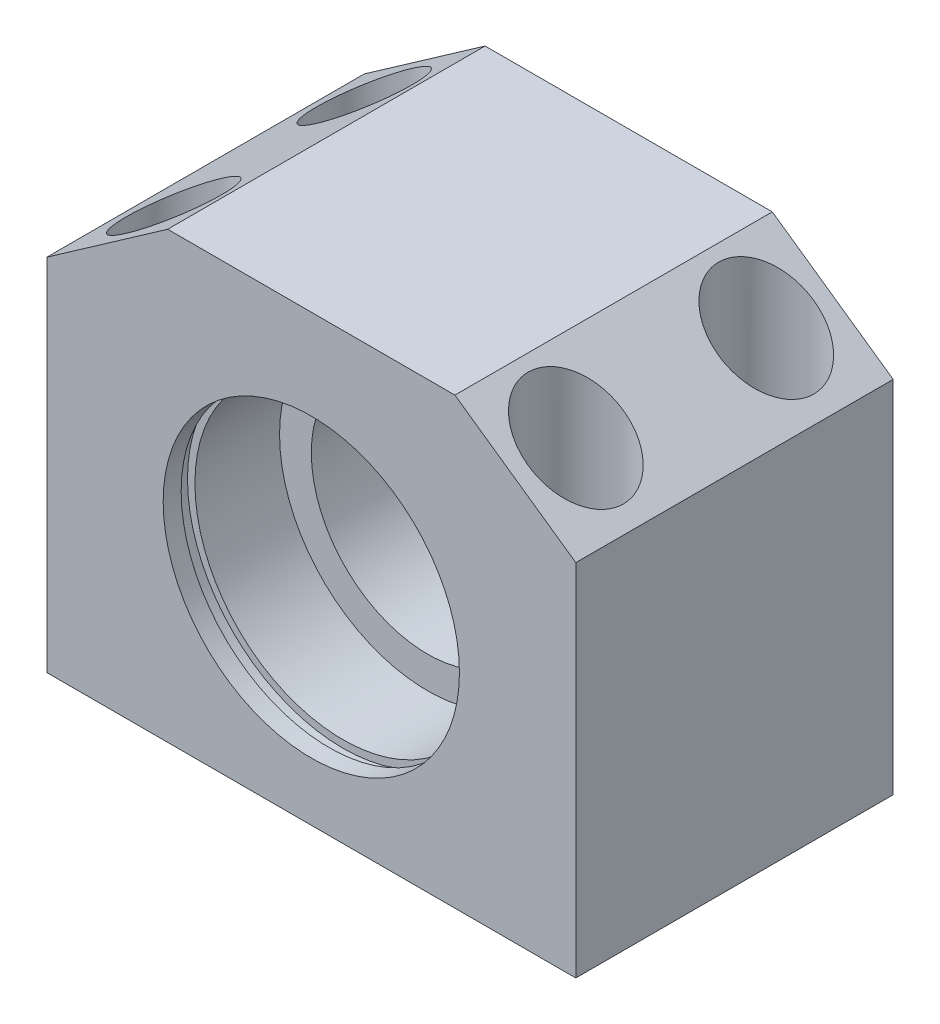
ISO-10303-21;
HEADER;
FILE_DESCRIPTION(('STEP AP214'),'2;1');
FILE_NAME('part.step','',(''),(''),'','','');
FILE_SCHEMA(('AUTOMOTIVE_DESIGN { 1 0 10303 214 1 1 1 1 }'));
ENDSEC;
DATA;
#1=APPLICATION_CONTEXT('core data for automotive mechanical design processes');
#2=APPLICATION_PROTOCOL_DEFINITION('international standard','automotive_design',2000,#1);
#3=PRODUCT_CONTEXT('',#1,'mechanical');
#4=PRODUCT('Part','Part','',(#3));
#5=PRODUCT_RELATED_PRODUCT_CATEGORY('part','',(#4));
#6=PRODUCT_DEFINITION_FORMATION('','',#4);
#7=PRODUCT_DEFINITION_CONTEXT('part definition',#1,'design');
#8=PRODUCT_DEFINITION('design','',#6,#7);
#9=PRODUCT_DEFINITION_SHAPE('','',#8);
#10=(LENGTH_UNIT() NAMED_UNIT(*) SI_UNIT(.MILLI.,.METRE.));
#11=(NAMED_UNIT(*) PLANE_ANGLE_UNIT() SI_UNIT($,.RADIAN.));
#12=(NAMED_UNIT(*) SI_UNIT($,.STERADIAN.) SOLID_ANGLE_UNIT());
#13=UNCERTAINTY_MEASURE_WITH_UNIT(LENGTH_MEASURE(1.E-05),#10,'distance_accuracy_value','');
#14=(GEOMETRIC_REPRESENTATION_CONTEXT(3) GLOBAL_UNCERTAINTY_ASSIGNED_CONTEXT((#13)) GLOBAL_UNIT_ASSIGNED_CONTEXT((#10,
#11,#12)) REPRESENTATION_CONTEXT('',''));
#15=CARTESIAN_POINT('',(0.,0.,0.));
#16=DIRECTION('',(0.,0.,1.));
#17=DIRECTION('',(1.,0.,0.));
#18=AXIS2_PLACEMENT_3D('',#15,#16,#17);
#19=CARTESIAN_POINT('',(0.,19.5,4.));
#20=DIRECTION('',(0.,0.,1.));
#21=DIRECTION('',(1.,0.,0.));
#22=AXIS2_PLACEMENT_3D('',#19,#20,#21);
#23=CYLINDRICAL_SURFACE('',#22,14.);
#24=CARTESIAN_POINT('',(0.,19.5,4.));
#25=DIRECTION('',(0.,0.,1.));
#26=DIRECTION('',(1.,0.,0.));
#27=AXIS2_PLACEMENT_3D('',#24,#25,#26);
#28=CIRCLE('',#27,14.);
#29=CARTESIAN_POINT('',(14.,19.5,4.));
#30=VERTEX_POINT('',#29);
#31=EDGE_CURVE('E131',#30,#30,#28,.T.);
#32=ORIENTED_EDGE('',*,*,#31,.F.);
#33=EDGE_LOOP('',(#32));
#34=FACE_BOUND('',#33,.T.);
#35=CARTESIAN_POINT('',(0.,19.5,12.));
#36=DIRECTION('',(0.,0.,-1.));
#37=DIRECTION('',(-1.,0.,0.));
#38=AXIS2_PLACEMENT_3D('',#35,#36,#37);
#39=CIRCLE('',#38,14.);
#40=CARTESIAN_POINT('',(-14.,19.5,12.));
#41=VERTEX_POINT('',#40);
#42=EDGE_CURVE('E139',#41,#41,#39,.T.);
#43=ORIENTED_EDGE('',*,*,#42,.F.);
#44=EDGE_LOOP('',(#43));
#45=FACE_BOUND('',#44,.T.);
#46=ADVANCED_FACE('F32',(#34,#45),#23,.F.);
#47=CARTESIAN_POINT('',(0.,19.5,15.));
#48=DIRECTION('',(0.,0.,1.));
#49=DIRECTION('',(1.,0.,0.));
#50=AXIS2_PLACEMENT_3D('',#47,#48,#49);
#51=CIRCLE('',#50,14.);
#52=CARTESIAN_POINT('',(14.,19.5,15.));
#53=VERTEX_POINT('',#52);
#54=EDGE_CURVE('E198',#53,#53,#51,.T.);
#55=ORIENTED_EDGE('',*,*,#54,.T.);
#56=EDGE_LOOP('',(#55));
#57=FACE_BOUND('',#56,.T.);
#58=CARTESIAN_POINT('',(0.,19.5,13.3));
#59=DIRECTION('',(0.,0.,-1.));
#60=DIRECTION('',(-1.,0.,0.));
#61=AXIS2_PLACEMENT_3D('',#58,#59,#60);
#62=CIRCLE('',#61,14.);
#63=CARTESIAN_POINT('',(-14.,19.5,13.3));
#64=VERTEX_POINT('',#63);
#65=EDGE_CURVE('E153',#64,#64,#62,.T.);
#66=ORIENTED_EDGE('',*,*,#65,.T.);
#67=EDGE_LOOP('',(#66));
#68=FACE_BOUND('',#67,.T.);
#69=ADVANCED_FACE('F234',(#57,#68),#23,.F.);
#70=CARTESIAN_POINT('',(0.,19.5,-15.));
#71=DIRECTION('',(0.,0.,1.));
#72=DIRECTION('',(1.,0.,0.));
#73=AXIS2_PLACEMENT_3D('',#70,#71,#72);
#74=CYLINDRICAL_SURFACE('',#73,11.);
#75=CARTESIAN_POINT('',(0.,19.5,-15.));
#76=DIRECTION('',(0.,0.,1.));
#77=DIRECTION('',(1.,0.,0.));
#78=AXIS2_PLACEMENT_3D('',#75,#76,#77);
#79=CIRCLE('',#78,11.);
#80=CARTESIAN_POINT('',(11.,19.5,-15.));
#81=VERTEX_POINT('',#80);
#82=EDGE_CURVE('E111',#81,#81,#79,.T.);
#83=ORIENTED_EDGE('',*,*,#82,.F.);
#84=EDGE_LOOP('',(#83));
#85=FACE_BOUND('',#84,.T.);
#86=CARTESIAN_POINT('',(0.,19.5,4.));
#87=DIRECTION('',(0.,0.,1.));
#88=DIRECTION('',(1.,0.,0.));
#89=AXIS2_PLACEMENT_3D('',#86,#87,#88);
#90=CIRCLE('',#89,11.);
#91=CARTESIAN_POINT('',(11.,19.5,4.));
#92=VERTEX_POINT('',#91);
#93=EDGE_CURVE('E116',#92,#92,#90,.F.);
#94=ORIENTED_EDGE('',*,*,#93,.F.);
#95=EDGE_LOOP('',(#94));
#96=FACE_BOUND('',#95,.T.);
#97=ADVANCED_FACE('F240',(#85,#96),#74,.F.);
#98=CARTESIAN_POINT('',(25.,42.,15.));
#99=DIRECTION('',(-1.,0.,0.));
#100=DIRECTION('',(0.,0.,1.));
#101=AXIS2_PLACEMENT_3D('',#98,#99,#100);
#102=PLANE('',#101);
#103=DIRECTION('',(0.,-1.,0.));
#104=VECTOR('',#103,1.);
#105=CARTESIAN_POINT('',(25.,42.,-15.));
#106=LINE('',#105,#104);
#107=CARTESIAN_POINT('',(25.,34.,-15.));
#108=VERTEX_POINT('',#107);
#109=CARTESIAN_POINT('',(25.,0.,-15.));
#110=VERTEX_POINT('',#109);
#111=EDGE_CURVE('E11',#108,#110,#106,.T.);
#112=ORIENTED_EDGE('',*,*,#111,.F.);
#113=DIRECTION('',(0.,0.,1.));
#114=VECTOR('',#113,1.);
#115=CARTESIAN_POINT('',(25.,34.,-15.));
#116=LINE('',#115,#114);
#117=CARTESIAN_POINT('',(25.,34.,15.));
#118=VERTEX_POINT('',#117);
#119=EDGE_CURVE('E85',#108,#118,#116,.T.);
#120=ORIENTED_EDGE('',*,*,#119,.T.);
#121=DIRECTION('',(0.,-1.,0.));
#122=VECTOR('',#121,1.);
#123=CARTESIAN_POINT('',(25.,42.,15.));
#124=LINE('',#123,#122);
#125=CARTESIAN_POINT('',(25.,0.,15.));
#126=VERTEX_POINT('',#125);
#127=EDGE_CURVE('E106',#118,#126,#124,.T.);
#128=ORIENTED_EDGE('',*,*,#127,.T.);
#129=DIRECTION('',(0.,0.,-1.));
#130=VECTOR('',#129,1.);
#131=CARTESIAN_POINT('',(25.,0.,15.));
#132=LINE('',#131,#130);
#133=EDGE_CURVE('E105',#126,#110,#132,.T.);
#134=ORIENTED_EDGE('',*,*,#133,.T.);
#135=EDGE_LOOP('',(#112,#120,#128,#134));
#136=FACE_BOUND('',#135,.T.);
#137=ADVANCED_FACE('F34',(#136),#102,.F.);
#138=CARTESIAN_POINT('',(-25.,42.,-15.));
#139=DIRECTION('',(0.,0.,1.));
#140=DIRECTION('',(1.,0.,0.));
#141=AXIS2_PLACEMENT_3D('',#138,#139,#140);
#142=PLANE('',#141);
#143=ORIENTED_EDGE('',*,*,#82,.T.);
#144=EDGE_LOOP('',(#143));
#145=FACE_BOUND('',#144,.T.);
#146=DIRECTION('',(-1.,0.,0.));
#147=VECTOR('',#146,1.);
#148=CARTESIAN_POINT('',(-25.,42.,-15.));
#149=LINE('',#148,#147);
#150=CARTESIAN_POINT('',(13.5748159460631,42.,-15.));
#151=VERTEX_POINT('',#150);
#152=CARTESIAN_POINT('',(-13.5748159460631,42.,-15.));
#153=VERTEX_POINT('',#152);
#154=EDGE_CURVE('E101',#151,#153,#149,.T.);
#155=ORIENTED_EDGE('',*,*,#154,.F.);
#156=DIRECTION('',(0.819152044288991,-0.573576436351047,0.));
#157=VECTOR('',#156,1.);
#158=CARTESIAN_POINT('',(24.1995227617896,34.5605001963602,-15.));
#159=LINE('',#158,#157);
#160=EDGE_CURVE('E49',#151,#108,#159,.T.);
#161=ORIENTED_EDGE('',*,*,#160,.T.);
#162=ORIENTED_EDGE('',*,*,#111,.T.);
#163=DIRECTION('',(-1.,0.,0.));
#164=VECTOR('',#163,1.);
#165=CARTESIAN_POINT('',(-25.,0.,-15.));
#166=LINE('',#165,#164);
#167=CARTESIAN_POINT('',(-25.,0.,-15.));
#168=VERTEX_POINT('',#167);
#169=EDGE_CURVE('E110',#110,#168,#166,.T.);
#170=ORIENTED_EDGE('',*,*,#169,.T.);
#171=DIRECTION('',(0.,-1.,0.));
#172=VECTOR('',#171,1.);
#173=CARTESIAN_POINT('',(-25.,42.,-15.));
#174=LINE('',#173,#172);
#175=CARTESIAN_POINT('',(-25.,34.,-15.));
#176=VERTEX_POINT('',#175);
#177=EDGE_CURVE('E41',#176,#168,#174,.T.);
#178=ORIENTED_EDGE('',*,*,#177,.F.);
#179=DIRECTION('',(0.819152044288991,0.573576436351048,0.));
#180=VECTOR('',#179,1.);
#181=CARTESIAN_POINT('',(-24.1995227617897,34.5605001963602,-15.));
#182=LINE('',#181,#180);
#183=EDGE_CURVE('E146',#176,#153,#182,.T.);
#184=ORIENTED_EDGE('',*,*,#183,.T.);
#185=EDGE_LOOP('',(#155,#161,#162,#170,#178,#184));
#186=FACE_BOUND('',#185,.T.);
#187=ADVANCED_FACE('F97',(#145,#186),#142,.F.);
#188=CARTESIAN_POINT('',(-25.,42.,15.));
#189=DIRECTION('',(1.,0.,0.));
#190=DIRECTION('',(0.,0.,-1.));
#191=AXIS2_PLACEMENT_3D('',#188,#189,#190);
#192=PLANE('',#191);
#193=DIRECTION('',(0.,-1.,0.));
#194=VECTOR('',#193,1.);
#195=CARTESIAN_POINT('',(-25.,42.,15.));
#196=LINE('',#195,#194);
#197=CARTESIAN_POINT('',(-25.,34.,15.));
#198=VERTEX_POINT('',#197);
#199=CARTESIAN_POINT('',(-25.,0.,15.));
#200=VERTEX_POINT('',#199);
#201=EDGE_CURVE('E127',#198,#200,#196,.T.);
#202=ORIENTED_EDGE('',*,*,#201,.F.);
#203=DIRECTION('',(0.,0.,1.));
#204=VECTOR('',#203,1.);
#205=CARTESIAN_POINT('',(-25.,34.,-15.));
#206=LINE('',#205,#204);
#207=EDGE_CURVE('E141',#176,#198,#206,.T.);
#208=ORIENTED_EDGE('',*,*,#207,.F.);
#209=ORIENTED_EDGE('',*,*,#177,.T.);
#210=DIRECTION('',(0.,0.,1.));
#211=VECTOR('',#210,1.);
#212=CARTESIAN_POINT('',(-25.,0.,15.));
#213=LINE('',#212,#211);
#214=EDGE_CURVE('E113',#168,#200,#213,.T.);
#215=ORIENTED_EDGE('',*,*,#214,.T.);
#216=EDGE_LOOP('',(#202,#208,#209,#215));
#217=FACE_BOUND('',#216,.T.);
#218=ADVANCED_FACE('F216',(#217),#192,.F.);
#219=CARTESIAN_POINT('',(-25.,42.,15.));
#220=DIRECTION('',(0.,0.,-1.));
#221=DIRECTION('',(-1.,0.,0.));
#222=AXIS2_PLACEMENT_3D('',#219,#220,#221);
#223=PLANE('',#222);
#224=ORIENTED_EDGE('',*,*,#54,.F.);
#225=EDGE_LOOP('',(#224));
#226=FACE_BOUND('',#225,.T.);
#227=ORIENTED_EDGE('',*,*,#127,.F.);
#228=DIRECTION('',(0.819152044288991,-0.573576436351047,0.));
#229=VECTOR('',#228,1.);
#230=CARTESIAN_POINT('',(24.1995227617896,34.5605001963602,15.));
#231=LINE('',#230,#229);
#232=CARTESIAN_POINT('',(13.5748159460631,42.,15.));
#233=VERTEX_POINT('',#232);
#234=EDGE_CURVE('E89',#233,#118,#231,.T.);
#235=ORIENTED_EDGE('',*,*,#234,.F.);
#236=DIRECTION('',(1.,0.,0.));
#237=VECTOR('',#236,1.);
#238=CARTESIAN_POINT('',(-25.,42.,15.));
#239=LINE('',#238,#237);
#240=CARTESIAN_POINT('',(-13.5748159460631,42.,15.));
#241=VERTEX_POINT('',#240);
#242=EDGE_CURVE('E119',#241,#233,#239,.T.);
#243=ORIENTED_EDGE('',*,*,#242,.F.);
#244=DIRECTION('',(0.819152044288991,0.573576436351048,0.));
#245=VECTOR('',#244,1.);
#246=CARTESIAN_POINT('',(-24.1995227617897,34.5605001963602,15.));
#247=LINE('',#246,#245);
#248=EDGE_CURVE('E57',#198,#241,#247,.T.);
#249=ORIENTED_EDGE('',*,*,#248,.F.);
#250=ORIENTED_EDGE('',*,*,#201,.T.);
#251=DIRECTION('',(1.,0.,0.));
#252=VECTOR('',#251,1.);
#253=CARTESIAN_POINT('',(-25.,0.,15.));
#254=LINE('',#253,#252);
#255=EDGE_CURVE('E124',#200,#126,#254,.T.);
#256=ORIENTED_EDGE('',*,*,#255,.T.);
#257=EDGE_LOOP('',(#227,#235,#243,#249,#250,#256));
#258=FACE_BOUND('',#257,.T.);
#259=ADVANCED_FACE('F204',(#226,#258),#223,.F.);
#260=CARTESIAN_POINT('',(0.,42.,0.));
#261=DIRECTION('',(0.,-1.,0.));
#262=DIRECTION('',(0.,0.,-1.));
#263=AXIS2_PLACEMENT_3D('',#260,#261,#262);
#264=PLANE('',#263);
#265=ORIENTED_EDGE('',*,*,#242,.T.);
#266=DIRECTION('',(0.,0.,1.));
#267=VECTOR('',#266,1.);
#268=CARTESIAN_POINT('',(13.5748159460631,42.,-15.));
#269=LINE('',#268,#267);
#270=EDGE_CURVE('E93',#151,#233,#269,.T.);
#271=ORIENTED_EDGE('',*,*,#270,.F.);
#272=ORIENTED_EDGE('',*,*,#154,.T.);
#273=DIRECTION('',(0.,0.,1.));
#274=VECTOR('',#273,1.);
#275=CARTESIAN_POINT('',(-13.5748159460631,42.,-15.));
#276=LINE('',#275,#274);
#277=EDGE_CURVE('E135',#153,#241,#276,.T.);
#278=ORIENTED_EDGE('',*,*,#277,.T.);
#279=EDGE_LOOP('',(#265,#271,#272,#278));
#280=FACE_BOUND('',#279,.T.);
#281=ADVANCED_FACE('F202',(#280),#264,.F.);
#282=CARTESIAN_POINT('',(0.,0.,0.));
#283=DIRECTION('',(0.,-1.,0.));
#284=DIRECTION('',(0.,0.,-1.));
#285=AXIS2_PLACEMENT_3D('',#282,#283,#284);
#286=PLANE('',#285);
#287=CARTESIAN_POINT('',(19.,0.,-9.));
#288=DIRECTION('',(0.,1.,0.));
#289=DIRECTION('',(0.,0.,1.));
#290=AXIS2_PLACEMENT_3D('',#287,#288,#289);
#291=CIRCLE('',#290,2.74999999999999);
#292=CARTESIAN_POINT('',(19.,0.,-6.25000000000001));
#293=VERTEX_POINT('',#292);
#294=EDGE_CURVE('E168',#293,#293,#291,.T.);
#295=ORIENTED_EDGE('',*,*,#294,.T.);
#296=EDGE_LOOP('',(#295));
#297=FACE_BOUND('',#296,.T.);
#298=CARTESIAN_POINT('',(19.,0.,9.));
#299=DIRECTION('',(0.,1.,0.));
#300=DIRECTION('',(0.,0.,1.));
#301=AXIS2_PLACEMENT_3D('',#298,#299,#300);
#302=CIRCLE('',#301,2.74999999999999);
#303=CARTESIAN_POINT('',(19.,0.,11.75));
#304=VERTEX_POINT('',#303);
#305=EDGE_CURVE('E177',#304,#304,#302,.T.);
#306=ORIENTED_EDGE('',*,*,#305,.T.);
#307=EDGE_LOOP('',(#306));
#308=FACE_BOUND('',#307,.T.);
#309=CARTESIAN_POINT('',(-19.,0.,9.));
#310=DIRECTION('',(0.,1.,0.));
#311=DIRECTION('',(0.,0.,1.));
#312=AXIS2_PLACEMENT_3D('',#309,#310,#311);
#313=CIRCLE('',#312,2.74999999999999);
#314=CARTESIAN_POINT('',(-19.,0.,11.75));
#315=VERTEX_POINT('',#314);
#316=EDGE_CURVE('E186',#315,#315,#313,.T.);
#317=ORIENTED_EDGE('',*,*,#316,.T.);
#318=EDGE_LOOP('',(#317));
#319=FACE_BOUND('',#318,.T.);
#320=CARTESIAN_POINT('',(-19.,0.,-9.));
#321=DIRECTION('',(0.,1.,0.));
#322=DIRECTION('',(0.,0.,1.));
#323=AXIS2_PLACEMENT_3D('',#320,#321,#322);
#324=CIRCLE('',#323,2.74999999999999);
#325=CARTESIAN_POINT('',(-19.,0.,-6.25000000000001));
#326=VERTEX_POINT('',#325);
#327=EDGE_CURVE('E195',#326,#326,#324,.T.);
#328=ORIENTED_EDGE('',*,*,#327,.T.);
#329=EDGE_LOOP('',(#328));
#330=FACE_BOUND('',#329,.T.);
#331=ORIENTED_EDGE('',*,*,#133,.F.);
#332=ORIENTED_EDGE('',*,*,#255,.F.);
#333=ORIENTED_EDGE('',*,*,#214,.F.);
#334=ORIENTED_EDGE('',*,*,#169,.F.);
#335=EDGE_LOOP('',(#331,#332,#333,#334));
#336=FACE_BOUND('',#335,.T.);
#337=ADVANCED_FACE('F218',(#297,#308,#319,#330,#336),#286,.T.);
#338=CARTESIAN_POINT('',(0.,19.5,4.));
#339=DIRECTION('',(0.,0.,1.));
#340=DIRECTION('',(1.,0.,0.));
#341=AXIS2_PLACEMENT_3D('',#338,#339,#340);
#342=PLANE('',#341);
#343=ORIENTED_EDGE('',*,*,#31,.T.);
#344=EDGE_LOOP('',(#343));
#345=FACE_BOUND('',#344,.T.);
#346=ORIENTED_EDGE('',*,*,#93,.T.);
#347=EDGE_LOOP('',(#346));
#348=FACE_BOUND('',#347,.T.);
#349=ADVANCED_FACE('F220',(#345,#348),#342,.T.);
#350=CARTESIAN_POINT('',(-19.,42.,-9.));
#351=DIRECTION('',(0.,1.,0.));
#352=DIRECTION('',(0.,0.,1.));
#353=AXIS2_PLACEMENT_3D('',#350,#351,#352);
#354=CYLINDRICAL_SURFACE('',#353,2.75);
#355=ORIENTED_EDGE('',*,*,#327,.F.);
#356=EDGE_LOOP('',(#355));
#357=FACE_BOUND('',#356,.T.);
#358=CARTESIAN_POINT('',(-19.,29.,-9.));
#359=DIRECTION('',(0.,1.,0.));
#360=DIRECTION('',(0.,0.,1.));
#361=AXIS2_PLACEMENT_3D('',#358,#359,#360);
#362=CIRCLE('',#361,2.75);
#363=CARTESIAN_POINT('',(-19.,29.,-6.25));
#364=VERTEX_POINT('',#363);
#365=EDGE_CURVE('E192',#364,#364,#362,.T.);
#366=ORIENTED_EDGE('',*,*,#365,.T.);
#367=EDGE_LOOP('',(#366));
#368=FACE_BOUND('',#367,.T.);
#369=ADVANCED_FACE('F227',(#357,#368),#354,.F.);
#370=CARTESIAN_POINT('',(-16.25,29.,-9.));
#371=DIRECTION('',(0.,-1.,0.));
#372=DIRECTION('',(0.,0.,-1.));
#373=AXIS2_PLACEMENT_3D('',#370,#371,#372);
#374=PLANE('',#373);
#375=ORIENTED_EDGE('',*,*,#365,.F.);
#376=EDGE_LOOP('',(#375));
#377=FACE_BOUND('',#376,.T.);
#378=CARTESIAN_POINT('',(-19.,29.,-9.));
#379=DIRECTION('',(0.,1.,0.));
#380=DIRECTION('',(0.,0.,1.));
#381=AXIS2_PLACEMENT_3D('',#378,#379,#380);
#382=CIRCLE('',#381,4.5);
#383=CARTESIAN_POINT('',(-19.,29.,-4.5));
#384=VERTEX_POINT('',#383);
#385=EDGE_CURVE('E189',#384,#384,#382,.T.);
#386=ORIENTED_EDGE('',*,*,#385,.T.);
#387=EDGE_LOOP('',(#386));
#388=FACE_BOUND('',#387,.T.);
#389=ADVANCED_FACE('F326',(#377,#388),#374,.F.);
#390=CARTESIAN_POINT('',(-19.,42.,-9.));
#391=DIRECTION('',(0.,1.,0.));
#392=DIRECTION('',(0.,0.,1.));
#393=AXIS2_PLACEMENT_3D('',#390,#391,#392);
#394=CYLINDRICAL_SURFACE('',#393,4.5);
#395=CARTESIAN_POINT('',(-19.,38.2012452292583,-9.));
#396=DIRECTION('',(0.573576436351048,-0.819152044288991,0.));
#397=DIRECTION('',(0.819152044288991,0.573576436351048,0.));
#398=AXIS2_PLACEMENT_3D('',#395,#396,#397);
#399=ELLIPSE('',#398,5.49348564942656,4.5);
#400=CARTESIAN_POINT('',(-14.5,41.352179151202,-9.));
#401=VERTEX_POINT('',#400);
#402=EDGE_CURVE('E134',#401,#401,#399,.F.);
#403=ORIENTED_EDGE('',*,*,#402,.T.);
#404=EDGE_LOOP('',(#403));
#405=FACE_BOUND('',#404,.T.);
#406=ORIENTED_EDGE('',*,*,#385,.F.);
#407=EDGE_LOOP('',(#406));
#408=FACE_BOUND('',#407,.T.);
#409=ADVANCED_FACE('F322',(#405,#408),#394,.F.);
#410=CARTESIAN_POINT('',(-19.,42.,9.));
#411=DIRECTION('',(0.,1.,0.));
#412=DIRECTION('',(0.,0.,1.));
#413=AXIS2_PLACEMENT_3D('',#410,#411,#412);
#414=CYLINDRICAL_SURFACE('',#413,2.75);
#415=ORIENTED_EDGE('',*,*,#316,.F.);
#416=EDGE_LOOP('',(#415));
#417=FACE_BOUND('',#416,.T.);
#418=CARTESIAN_POINT('',(-19.,29.,9.));
#419=DIRECTION('',(0.,1.,0.));
#420=DIRECTION('',(0.,0.,1.));
#421=AXIS2_PLACEMENT_3D('',#418,#419,#420);
#422=CIRCLE('',#421,2.75);
#423=CARTESIAN_POINT('',(-19.,29.,11.75));
#424=VERTEX_POINT('',#423);
#425=EDGE_CURVE('E183',#424,#424,#422,.T.);
#426=ORIENTED_EDGE('',*,*,#425,.T.);
#427=EDGE_LOOP('',(#426));
#428=FACE_BOUND('',#427,.T.);
#429=ADVANCED_FACE('F318',(#417,#428),#414,.F.);
#430=CARTESIAN_POINT('',(-16.25,29.,9.));
#431=DIRECTION('',(0.,-1.,0.));
#432=DIRECTION('',(0.,0.,-1.));
#433=AXIS2_PLACEMENT_3D('',#430,#431,#432);
#434=PLANE('',#433);
#435=ORIENTED_EDGE('',*,*,#425,.F.);
#436=EDGE_LOOP('',(#435));
#437=FACE_BOUND('',#436,.T.);
#438=CARTESIAN_POINT('',(-19.,29.,9.));
#439=DIRECTION('',(0.,1.,0.));
#440=DIRECTION('',(0.,0.,1.));
#441=AXIS2_PLACEMENT_3D('',#438,#439,#440);
#442=CIRCLE('',#441,4.5);
#443=CARTESIAN_POINT('',(-19.,29.,13.5));
#444=VERTEX_POINT('',#443);
#445=EDGE_CURVE('E180',#444,#444,#442,.T.);
#446=ORIENTED_EDGE('',*,*,#445,.T.);
#447=EDGE_LOOP('',(#446));
#448=FACE_BOUND('',#447,.T.);
#449=ADVANCED_FACE('F315',(#437,#448),#434,.F.);
#450=CARTESIAN_POINT('',(-19.,42.,9.));
#451=DIRECTION('',(0.,1.,0.));
#452=DIRECTION('',(0.,0.,1.));
#453=AXIS2_PLACEMENT_3D('',#450,#451,#452);
#454=CYLINDRICAL_SURFACE('',#453,4.5);
#455=CARTESIAN_POINT('',(-19.,38.2012452292583,9.));
#456=DIRECTION('',(0.573576436351048,-0.819152044288991,0.));
#457=DIRECTION('',(0.819152044288991,0.573576436351048,0.));
#458=AXIS2_PLACEMENT_3D('',#455,#456,#457);
#459=ELLIPSE('',#458,5.49348564942656,4.5);
#460=CARTESIAN_POINT('',(-14.5,41.352179151202,9.));
#461=VERTEX_POINT('',#460);
#462=EDGE_CURVE('E132',#461,#461,#459,.F.);
#463=ORIENTED_EDGE('',*,*,#462,.T.);
#464=EDGE_LOOP('',(#463));
#465=FACE_BOUND('',#464,.T.);
#466=ORIENTED_EDGE('',*,*,#445,.F.);
#467=EDGE_LOOP('',(#466));
#468=FACE_BOUND('',#467,.T.);
#469=ADVANCED_FACE('F311',(#465,#468),#454,.F.);
#470=CARTESIAN_POINT('',(19.,42.,9.));
#471=DIRECTION('',(0.,1.,0.));
#472=DIRECTION('',(0.,0.,1.));
#473=AXIS2_PLACEMENT_3D('',#470,#471,#472);
#474=CYLINDRICAL_SURFACE('',#473,2.75);
#475=ORIENTED_EDGE('',*,*,#305,.F.);
#476=EDGE_LOOP('',(#475));
#477=FACE_BOUND('',#476,.T.);
#478=CARTESIAN_POINT('',(19.,29.,9.));
#479=DIRECTION('',(0.,1.,0.));
#480=DIRECTION('',(0.,0.,1.));
#481=AXIS2_PLACEMENT_3D('',#478,#479,#480);
#482=CIRCLE('',#481,2.75);
#483=CARTESIAN_POINT('',(19.,29.,11.75));
#484=VERTEX_POINT('',#483);
#485=EDGE_CURVE('E174',#484,#484,#482,.T.);
#486=ORIENTED_EDGE('',*,*,#485,.T.);
#487=EDGE_LOOP('',(#486));
#488=FACE_BOUND('',#487,.T.);
#489=ADVANCED_FACE('F307',(#477,#488),#474,.F.);
#490=CARTESIAN_POINT('',(21.75,29.,9.));
#491=DIRECTION('',(0.,-1.,0.));
#492=DIRECTION('',(0.,0.,-1.));
#493=AXIS2_PLACEMENT_3D('',#490,#491,#492);
#494=PLANE('',#493);
#495=ORIENTED_EDGE('',*,*,#485,.F.);
#496=EDGE_LOOP('',(#495));
#497=FACE_BOUND('',#496,.T.);
#498=CARTESIAN_POINT('',(19.,29.,9.));
#499=DIRECTION('',(0.,1.,0.));
#500=DIRECTION('',(0.,0.,1.));
#501=AXIS2_PLACEMENT_3D('',#498,#499,#500);
#502=CIRCLE('',#501,4.5);
#503=CARTESIAN_POINT('',(19.,29.,13.5));
#504=VERTEX_POINT('',#503);
#505=EDGE_CURVE('E171',#504,#504,#502,.T.);
#506=ORIENTED_EDGE('',*,*,#505,.T.);
#507=EDGE_LOOP('',(#506));
#508=FACE_BOUND('',#507,.T.);
#509=ADVANCED_FACE('F303',(#497,#508),#494,.F.);
#510=CARTESIAN_POINT('',(19.,42.,9.));
#511=DIRECTION('',(0.,1.,0.));
#512=DIRECTION('',(0.,0.,1.));
#513=AXIS2_PLACEMENT_3D('',#510,#511,#512);
#514=CYLINDRICAL_SURFACE('',#513,4.5);
#515=CARTESIAN_POINT('',(19.,38.2012452292583,9.));
#516=DIRECTION('',(-0.573576436351047,-0.819152044288991,0.));
#517=DIRECTION('',(-0.819152044288991,0.573576436351047,0.));
#518=AXIS2_PLACEMENT_3D('',#515,#516,#517);
#519=ELLIPSE('',#518,5.49348564942655,4.5);
#520=CARTESIAN_POINT('',(14.5,41.352179151202,9.));
#521=VERTEX_POINT('',#520);
#522=EDGE_CURVE('E209',#521,#521,#519,.F.);
#523=ORIENTED_EDGE('',*,*,#522,.T.);
#524=EDGE_LOOP('',(#523));
#525=FACE_BOUND('',#524,.T.);
#526=ORIENTED_EDGE('',*,*,#505,.F.);
#527=EDGE_LOOP('',(#526));
#528=FACE_BOUND('',#527,.T.);
#529=ADVANCED_FACE('F299',(#525,#528),#514,.F.);
#530=CARTESIAN_POINT('',(19.,42.,-9.));
#531=DIRECTION('',(0.,1.,0.));
#532=DIRECTION('',(0.,0.,1.));
#533=AXIS2_PLACEMENT_3D('',#530,#531,#532);
#534=CYLINDRICAL_SURFACE('',#533,2.75);
#535=ORIENTED_EDGE('',*,*,#294,.F.);
#536=EDGE_LOOP('',(#535));
#537=FACE_BOUND('',#536,.T.);
#538=CARTESIAN_POINT('',(19.,29.,-9.));
#539=DIRECTION('',(0.,1.,0.));
#540=DIRECTION('',(0.,0.,1.));
#541=AXIS2_PLACEMENT_3D('',#538,#539,#540);
#542=CIRCLE('',#541,2.75);
#543=CARTESIAN_POINT('',(19.,29.,-6.25));
#544=VERTEX_POINT('',#543);
#545=EDGE_CURVE('E165',#544,#544,#542,.T.);
#546=ORIENTED_EDGE('',*,*,#545,.T.);
#547=EDGE_LOOP('',(#546));
#548=FACE_BOUND('',#547,.T.);
#549=ADVANCED_FACE('F295',(#537,#548),#534,.F.);
#550=CARTESIAN_POINT('',(21.75,29.,-9.));
#551=DIRECTION('',(0.,-1.,0.));
#552=DIRECTION('',(0.,0.,-1.));
#553=AXIS2_PLACEMENT_3D('',#550,#551,#552);
#554=PLANE('',#553);
#555=ORIENTED_EDGE('',*,*,#545,.F.);
#556=EDGE_LOOP('',(#555));
#557=FACE_BOUND('',#556,.T.);
#558=CARTESIAN_POINT('',(19.,29.,-9.));
#559=DIRECTION('',(0.,1.,0.));
#560=DIRECTION('',(0.,0.,1.));
#561=AXIS2_PLACEMENT_3D('',#558,#559,#560);
#562=CIRCLE('',#561,4.5);
#563=CARTESIAN_POINT('',(19.,29.,-4.5));
#564=VERTEX_POINT('',#563);
#565=EDGE_CURVE('E162',#564,#564,#562,.T.);
#566=ORIENTED_EDGE('',*,*,#565,.T.);
#567=EDGE_LOOP('',(#566));
#568=FACE_BOUND('',#567,.T.);
#569=ADVANCED_FACE('F291',(#557,#568),#554,.F.);
#570=CARTESIAN_POINT('',(19.,42.,-9.));
#571=DIRECTION('',(0.,1.,0.));
#572=DIRECTION('',(0.,0.,1.));
#573=AXIS2_PLACEMENT_3D('',#570,#571,#572);
#574=CYLINDRICAL_SURFACE('',#573,4.5);
#575=CARTESIAN_POINT('',(19.,38.2012452292583,-9.));
#576=DIRECTION('',(-0.573576436351047,-0.819152044288991,0.));
#577=DIRECTION('',(-0.819152044288991,0.573576436351047,0.));
#578=AXIS2_PLACEMENT_3D('',#575,#576,#577);
#579=ELLIPSE('',#578,5.49348564942655,4.5);
#580=CARTESIAN_POINT('',(14.5,41.352179151202,-9.));
#581=VERTEX_POINT('',#580);
#582=EDGE_CURVE('E36',#581,#581,#579,.F.);
#583=ORIENTED_EDGE('',*,*,#582,.T.);
#584=EDGE_LOOP('',(#583));
#585=FACE_BOUND('',#584,.T.);
#586=ORIENTED_EDGE('',*,*,#565,.F.);
#587=EDGE_LOOP('',(#586));
#588=FACE_BOUND('',#587,.T.);
#589=ADVANCED_FACE('F287',(#585,#588),#574,.F.);
#590=CARTESIAN_POINT('',(0.,5.5,12.));
#591=DIRECTION('',(0.,0.,1.));
#592=DIRECTION('',(1.,0.,0.));
#593=AXIS2_PLACEMENT_3D('',#590,#591,#592);
#594=PLANE('',#593);
#595=ORIENTED_EDGE('',*,*,#42,.T.);
#596=EDGE_LOOP('',(#595));
#597=FACE_BOUND('',#596,.T.);
#598=CARTESIAN_POINT('',(0.,19.5,12.));
#599=DIRECTION('',(0.,0.,-1.));
#600=DIRECTION('',(-1.,0.,0.));
#601=AXIS2_PLACEMENT_3D('',#598,#599,#600);
#602=CIRCLE('',#601,14.7);
#603=CARTESIAN_POINT('',(-14.7,19.5,12.));
#604=VERTEX_POINT('',#603);
#605=EDGE_CURVE('E159',#604,#604,#602,.T.);
#606=ORIENTED_EDGE('',*,*,#605,.F.);
#607=EDGE_LOOP('',(#606));
#608=FACE_BOUND('',#607,.T.);
#609=ADVANCED_FACE('F280',(#597,#608),#594,.T.);
#610=CARTESIAN_POINT('',(0.,19.5,9.29464911712331));
#611=DIRECTION('',(0.,0.,-1.));
#612=DIRECTION('',(-1.,0.,0.));
#613=AXIS2_PLACEMENT_3D('',#610,#611,#612);
#614=CYLINDRICAL_SURFACE('',#613,14.7);
#615=ORIENTED_EDGE('',*,*,#605,.T.);
#616=EDGE_LOOP('',(#615));
#617=FACE_BOUND('',#616,.T.);
#618=CARTESIAN_POINT('',(0.,19.5,13.3));
#619=DIRECTION('',(0.,0.,-1.));
#620=DIRECTION('',(-1.,0.,0.));
#621=AXIS2_PLACEMENT_3D('',#618,#619,#620);
#622=CIRCLE('',#621,14.7);
#623=CARTESIAN_POINT('',(-14.7,19.5,13.3));
#624=VERTEX_POINT('',#623);
#625=EDGE_CURVE('E156',#624,#624,#622,.T.);
#626=ORIENTED_EDGE('',*,*,#625,.F.);
#627=EDGE_LOOP('',(#626));
#628=FACE_BOUND('',#627,.T.);
#629=ADVANCED_FACE('F271',(#617,#628),#614,.F.);
#630=CARTESIAN_POINT('',(0.,5.5,13.3));
#631=DIRECTION('',(0.,0.,-1.));
#632=DIRECTION('',(-1.,0.,0.));
#633=AXIS2_PLACEMENT_3D('',#630,#631,#632);
#634=PLANE('',#633);
#635=ORIENTED_EDGE('',*,*,#625,.T.);
#636=EDGE_LOOP('',(#635));
#637=FACE_BOUND('',#636,.T.);
#638=ORIENTED_EDGE('',*,*,#65,.F.);
#639=EDGE_LOOP('',(#638));
#640=FACE_BOUND('',#639,.T.);
#641=ADVANCED_FACE('F269',(#637,#640),#634,.T.);
#642=CARTESIAN_POINT('',(-24.1995227617897,34.5605001963602,-15.));
#643=DIRECTION('',(0.573576436351048,-0.819152044288991,0.));
#644=DIRECTION('',(0.819152044288991,0.573576436351048,0.));
#645=AXIS2_PLACEMENT_3D('',#642,#643,#644);
#646=PLANE('',#645);
#647=ORIENTED_EDGE('',*,*,#462,.F.);
#648=EDGE_LOOP('',(#647));
#649=FACE_BOUND('',#648,.T.);
#650=ORIENTED_EDGE('',*,*,#248,.T.);
#651=ORIENTED_EDGE('',*,*,#277,.F.);
#652=ORIENTED_EDGE('',*,*,#183,.F.);
#653=ORIENTED_EDGE('',*,*,#207,.T.);
#654=EDGE_LOOP('',(#650,#651,#652,#653));
#655=FACE_BOUND('',#654,.T.);
#656=ORIENTED_EDGE('',*,*,#402,.F.);
#657=EDGE_LOOP('',(#656));
#658=FACE_BOUND('',#657,.T.);
#659=ADVANCED_FACE('F213',(#649,#655,#658),#646,.F.);
#660=CARTESIAN_POINT('',(24.1995227617896,34.5605001963602,-15.));
#661=DIRECTION('',(-0.573576436351047,-0.819152044288991,0.));
#662=DIRECTION('',(0.819152044288991,-0.573576436351047,0.));
#663=AXIS2_PLACEMENT_3D('',#660,#661,#662);
#664=PLANE('',#663);
#665=ORIENTED_EDGE('',*,*,#582,.F.);
#666=EDGE_LOOP('',(#665));
#667=FACE_BOUND('',#666,.T.);
#668=ORIENTED_EDGE('',*,*,#234,.T.);
#669=ORIENTED_EDGE('',*,*,#119,.F.);
#670=ORIENTED_EDGE('',*,*,#160,.F.);
#671=ORIENTED_EDGE('',*,*,#270,.T.);
#672=EDGE_LOOP('',(#668,#669,#670,#671));
#673=FACE_BOUND('',#672,.T.);
#674=ORIENTED_EDGE('',*,*,#522,.F.);
#675=EDGE_LOOP('',(#674));
#676=FACE_BOUND('',#675,.T.);
#677=ADVANCED_FACE('F86',(#667,#673,#676),#664,.F.);
#678=CLOSED_SHELL('',(#46,#69,#97,#137,#187,#218,#259,#281,#337,#349,#369,#389,#409,#429,#449,
#469,#489,#509,#529,#549,#569,#589,#609,#629,#641,#659,#677));
#679=MANIFOLD_SOLID_BREP('B2',#678);
#680=ADVANCED_BREP_SHAPE_REPRESENTATION('',(#18,#679),#14);
#681=SHAPE_DEFINITION_REPRESENTATION(#9,#680);
ENDSEC;
END-ISO-10303-21;
